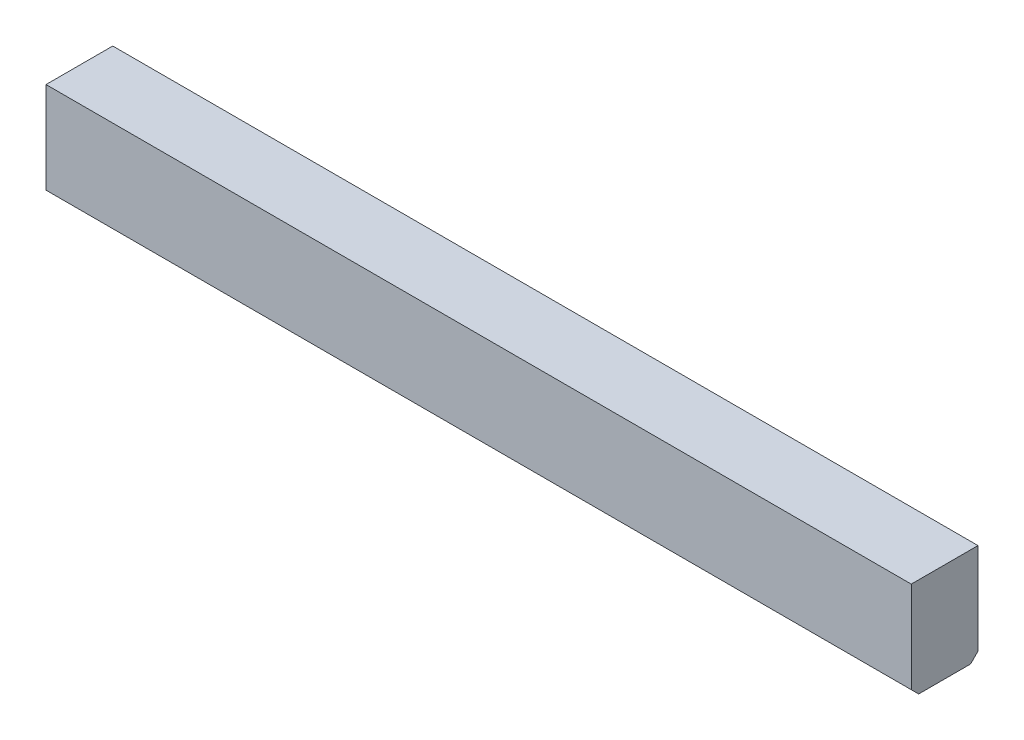
ISO-10303-21;
HEADER;
FILE_DESCRIPTION(('STEP AP214'),'2;1');
FILE_NAME('part.step','',(''),(''),'','','');
FILE_SCHEMA(('AUTOMOTIVE_DESIGN { 1 0 10303 214 1 1 1 1 }'));
ENDSEC;
DATA;
#1=APPLICATION_CONTEXT('core data for automotive mechanical design processes');
#2=APPLICATION_PROTOCOL_DEFINITION('international standard','automotive_design',2000,#1);
#3=PRODUCT_CONTEXT('',#1,'mechanical');
#4=PRODUCT('Part','Part','',(#3));
#5=PRODUCT_RELATED_PRODUCT_CATEGORY('part','',(#4));
#6=PRODUCT_DEFINITION_FORMATION('','',#4);
#7=PRODUCT_DEFINITION_CONTEXT('part definition',#1,'design');
#8=PRODUCT_DEFINITION('design','',#6,#7);
#9=PRODUCT_DEFINITION_SHAPE('','',#8);
#10=(LENGTH_UNIT() NAMED_UNIT(*) SI_UNIT(.MILLI.,.METRE.));
#11=(NAMED_UNIT(*) PLANE_ANGLE_UNIT() SI_UNIT($,.RADIAN.));
#12=(NAMED_UNIT(*) SI_UNIT($,.STERADIAN.) SOLID_ANGLE_UNIT());
#13=UNCERTAINTY_MEASURE_WITH_UNIT(LENGTH_MEASURE(1.E-05),#10,'distance_accuracy_value','');
#14=(GEOMETRIC_REPRESENTATION_CONTEXT(3) GLOBAL_UNCERTAINTY_ASSIGNED_CONTEXT((#13)) GLOBAL_UNIT_ASSIGNED_CONTEXT((#10,
#11,#12)) REPRESENTATION_CONTEXT('',''));
#15=CARTESIAN_POINT('',(0.,0.,0.));
#16=DIRECTION('',(0.,0.,1.));
#17=DIRECTION('',(1.,0.,0.));
#18=AXIS2_PLACEMENT_3D('',#15,#16,#17);
#19=CARTESIAN_POINT('',(0.,0.,27.));
#20=DIRECTION('',(1.,0.,0.));
#21=DIRECTION('',(0.,0.,-1.));
#22=AXIS2_PLACEMENT_3D('',#19,#20,#21);
#23=PLANE('',#22);
#24=DIRECTION('',(0.,-1.,0.));
#25=VECTOR('',#24,1.);
#26=CARTESIAN_POINT('',(0.,0.,0.));
#27=LINE('',#26,#25);
#28=CARTESIAN_POINT('',(0.,40.,0.));
#29=VERTEX_POINT('',#28);
#30=CARTESIAN_POINT('',(0.,2.99999999999998,0.));
#31=VERTEX_POINT('',#30);
#32=EDGE_CURVE('E122',#29,#31,#27,.T.);
#33=ORIENTED_EDGE('',*,*,#32,.T.);
#34=DIRECTION('',(0.,-0.707106781186551,0.707106781186544));
#35=VECTOR('',#34,1.);
#36=CARTESIAN_POINT('',(0.,0.,2.99999999999995));
#37=LINE('',#36,#35);
#38=CARTESIAN_POINT('',(0.,0.,2.99999999999995));
#39=VERTEX_POINT('',#38);
#40=EDGE_CURVE('E48',#31,#39,#37,.T.);
#41=ORIENTED_EDGE('',*,*,#40,.T.);
#42=DIRECTION('',(0.,0.,-1.));
#43=VECTOR('',#42,1.);
#44=CARTESIAN_POINT('',(0.,0.,27.));
#45=LINE('',#44,#43);
#46=CARTESIAN_POINT('',(0.,0.,24.));
#47=VERTEX_POINT('',#46);
#48=EDGE_CURVE('E128',#47,#39,#45,.T.);
#49=ORIENTED_EDGE('',*,*,#48,.F.);
#50=DIRECTION('',(0.,-0.707106781186544,-0.707106781186551));
#51=VECTOR('',#50,1.);
#52=CARTESIAN_POINT('',(0.,3.,27.));
#53=LINE('',#52,#51);
#54=CARTESIAN_POINT('',(0.,3.,27.));
#55=VERTEX_POINT('',#54);
#56=EDGE_CURVE('E55',#47,#55,#53,.F.);
#57=ORIENTED_EDGE('',*,*,#56,.T.);
#58=DIRECTION('',(0.,-1.,0.));
#59=VECTOR('',#58,1.);
#60=CARTESIAN_POINT('',(0.,0.,27.));
#61=LINE('',#60,#59);
#62=CARTESIAN_POINT('',(0.,40.,27.));
#63=VERTEX_POINT('',#62);
#64=EDGE_CURVE('E104',#63,#55,#61,.T.);
#65=ORIENTED_EDGE('',*,*,#64,.F.);
#66=DIRECTION('',(0.,0.,-1.));
#67=VECTOR('',#66,1.);
#68=CARTESIAN_POINT('',(0.,40.,27.));
#69=LINE('',#68,#67);
#70=EDGE_CURVE('E114',#63,#29,#69,.T.);
#71=ORIENTED_EDGE('',*,*,#70,.T.);
#72=EDGE_LOOP('',(#33,#41,#49,#57,#65,#71));
#73=FACE_BOUND('',#72,.T.);
#74=ADVANCED_FACE('F39',(#73),#23,.F.);
#75=CARTESIAN_POINT('',(0.,0.,27.));
#76=DIRECTION('',(0.,1.,0.));
#77=DIRECTION('',(0.,0.,1.));
#78=AXIS2_PLACEMENT_3D('',#75,#76,#77);
#79=PLANE('',#78);
#80=ORIENTED_EDGE('',*,*,#48,.T.);
#81=DIRECTION('',(1.,0.,0.));
#82=VECTOR('',#81,1.);
#83=CARTESIAN_POINT('',(350.,0.,2.99999999999995));
#84=LINE('',#83,#82);
#85=CARTESIAN_POINT('',(350.,0.,2.99999999999995));
#86=VERTEX_POINT('',#85);
#87=EDGE_CURVE('E133',#39,#86,#84,.T.);
#88=ORIENTED_EDGE('',*,*,#87,.T.);
#89=DIRECTION('',(0.,0.,-1.));
#90=VECTOR('',#89,1.);
#91=CARTESIAN_POINT('',(350.,0.,27.));
#92=LINE('',#91,#90);
#93=CARTESIAN_POINT('',(350.,0.,24.));
#94=VERTEX_POINT('',#93);
#95=EDGE_CURVE('E113',#94,#86,#92,.T.);
#96=ORIENTED_EDGE('',*,*,#95,.F.);
#97=DIRECTION('',(-1.,0.,0.));
#98=VECTOR('',#97,1.);
#99=CARTESIAN_POINT('',(0.,0.,24.));
#100=LINE('',#99,#98);
#101=EDGE_CURVE('E131',#94,#47,#100,.T.);
#102=ORIENTED_EDGE('',*,*,#101,.T.);
#103=EDGE_LOOP('',(#80,#88,#96,#102));
#104=FACE_BOUND('',#103,.T.);
#105=ADVANCED_FACE('F145',(#104),#79,.F.);
#106=CARTESIAN_POINT('',(350.,0.,27.));
#107=DIRECTION('',(-1.,0.,0.));
#108=DIRECTION('',(0.,0.,1.));
#109=AXIS2_PLACEMENT_3D('',#106,#107,#108);
#110=PLANE('',#109);
#111=ORIENTED_EDGE('',*,*,#95,.T.);
#112=DIRECTION('',(0.,0.707106781186551,-0.707106781186544));
#113=VECTOR('',#112,1.);
#114=CARTESIAN_POINT('',(350.,0.,2.99999999999995));
#115=LINE('',#114,#113);
#116=CARTESIAN_POINT('',(350.,2.99999999999998,0.));
#117=VERTEX_POINT('',#116);
#118=EDGE_CURVE('E138',#86,#117,#115,.T.);
#119=ORIENTED_EDGE('',*,*,#118,.T.);
#120=DIRECTION('',(0.,1.,0.));
#121=VECTOR('',#120,1.);
#122=CARTESIAN_POINT('',(350.,0.,0.));
#123=LINE('',#122,#121);
#124=CARTESIAN_POINT('',(350.,40.,0.));
#125=VERTEX_POINT('',#124);
#126=EDGE_CURVE('E110',#117,#125,#123,.T.);
#127=ORIENTED_EDGE('',*,*,#126,.T.);
#128=DIRECTION('',(0.,0.,-1.));
#129=VECTOR('',#128,1.);
#130=CARTESIAN_POINT('',(350.,40.,27.));
#131=LINE('',#130,#129);
#132=CARTESIAN_POINT('',(350.,40.,27.));
#133=VERTEX_POINT('',#132);
#134=EDGE_CURVE('E107',#133,#125,#131,.T.);
#135=ORIENTED_EDGE('',*,*,#134,.F.);
#136=DIRECTION('',(0.,1.,0.));
#137=VECTOR('',#136,1.);
#138=CARTESIAN_POINT('',(350.,0.,27.));
#139=LINE('',#138,#137);
#140=CARTESIAN_POINT('',(350.,3.,27.));
#141=VERTEX_POINT('',#140);
#142=EDGE_CURVE('E96',#141,#133,#139,.T.);
#143=ORIENTED_EDGE('',*,*,#142,.F.);
#144=DIRECTION('',(0.,0.707106781186544,0.707106781186551));
#145=VECTOR('',#144,1.);
#146=CARTESIAN_POINT('',(350.,3.,27.));
#147=LINE('',#146,#145);
#148=EDGE_CURVE('E136',#141,#94,#147,.F.);
#149=ORIENTED_EDGE('',*,*,#148,.T.);
#150=EDGE_LOOP('',(#111,#119,#127,#135,#143,#149));
#151=FACE_BOUND('',#150,.T.);
#152=ADVANCED_FACE('F109',(#151),#110,.F.);
#153=CARTESIAN_POINT('',(0.,40.,27.));
#154=DIRECTION('',(0.,-1.,0.));
#155=DIRECTION('',(0.,0.,-1.));
#156=AXIS2_PLACEMENT_3D('',#153,#154,#155);
#157=PLANE('',#156);
#158=DIRECTION('',(-1.,0.,0.));
#159=VECTOR('',#158,1.);
#160=CARTESIAN_POINT('',(0.,40.,0.));
#161=LINE('',#160,#159);
#162=EDGE_CURVE('E125',#125,#29,#161,.T.);
#163=ORIENTED_EDGE('',*,*,#162,.T.);
#164=ORIENTED_EDGE('',*,*,#70,.F.);
#165=DIRECTION('',(-1.,0.,0.));
#166=VECTOR('',#165,1.);
#167=CARTESIAN_POINT('',(0.,40.,27.));
#168=LINE('',#167,#166);
#169=EDGE_CURVE('E100',#133,#63,#168,.T.);
#170=ORIENTED_EDGE('',*,*,#169,.F.);
#171=ORIENTED_EDGE('',*,*,#134,.T.);
#172=EDGE_LOOP('',(#163,#164,#170,#171));
#173=FACE_BOUND('',#172,.T.);
#174=ADVANCED_FACE('F116',(#173),#157,.F.);
#175=CARTESIAN_POINT('',(0.,0.,27.));
#176=DIRECTION('',(0.,0.,-1.));
#177=DIRECTION('',(-1.,0.,0.));
#178=AXIS2_PLACEMENT_3D('',#175,#176,#177);
#179=PLANE('',#178);
#180=ORIENTED_EDGE('',*,*,#64,.T.);
#181=DIRECTION('',(1.,0.,0.));
#182=VECTOR('',#181,1.);
#183=CARTESIAN_POINT('',(0.,3.,27.));
#184=LINE('',#183,#182);
#185=EDGE_CURVE('E11',#55,#141,#184,.T.);
#186=ORIENTED_EDGE('',*,*,#185,.T.);
#187=ORIENTED_EDGE('',*,*,#142,.T.);
#188=ORIENTED_EDGE('',*,*,#169,.T.);
#189=EDGE_LOOP('',(#180,#186,#187,#188));
#190=FACE_BOUND('',#189,.T.);
#191=ADVANCED_FACE('F98',(#190),#179,.F.);
#192=CARTESIAN_POINT('',(0.,0.,0.));
#193=DIRECTION('',(0.,0.,-1.));
#194=DIRECTION('',(-1.,0.,0.));
#195=AXIS2_PLACEMENT_3D('',#192,#193,#194);
#196=PLANE('',#195);
#197=ORIENTED_EDGE('',*,*,#126,.F.);
#198=DIRECTION('',(-1.,0.,0.));
#199=VECTOR('',#198,1.);
#200=CARTESIAN_POINT('',(0.,2.99999999999998,0.));
#201=LINE('',#200,#199);
#202=EDGE_CURVE('E63',#117,#31,#201,.T.);
#203=ORIENTED_EDGE('',*,*,#202,.T.);
#204=ORIENTED_EDGE('',*,*,#32,.F.);
#205=ORIENTED_EDGE('',*,*,#162,.F.);
#206=EDGE_LOOP('',(#197,#203,#204,#205));
#207=FACE_BOUND('',#206,.T.);
#208=ADVANCED_FACE('F149',(#207),#196,.T.);
#209=CARTESIAN_POINT('',(0.,0.,2.99999999999995));
#210=DIRECTION('',(0.,-0.707106781186544,-0.707106781186551));
#211=DIRECTION('',(-1.,0.,0.));
#212=AXIS2_PLACEMENT_3D('',#209,#210,#211);
#213=PLANE('',#212);
#214=ORIENTED_EDGE('',*,*,#40,.F.);
#215=ORIENTED_EDGE('',*,*,#202,.F.);
#216=ORIENTED_EDGE('',*,*,#118,.F.);
#217=ORIENTED_EDGE('',*,*,#87,.F.);
#218=EDGE_LOOP('',(#214,#215,#216,#217));
#219=FACE_BOUND('',#218,.T.);
#220=ADVANCED_FACE('F148',(#219),#213,.T.);
#221=CARTESIAN_POINT('',(0.,3.,27.));
#222=DIRECTION('',(0.,0.707106781186551,-0.707106781186544));
#223=DIRECTION('',(1.,0.,0.));
#224=AXIS2_PLACEMENT_3D('',#221,#222,#223);
#225=PLANE('',#224);
#226=ORIENTED_EDGE('',*,*,#56,.F.);
#227=ORIENTED_EDGE('',*,*,#101,.F.);
#228=ORIENTED_EDGE('',*,*,#148,.F.);
#229=ORIENTED_EDGE('',*,*,#185,.F.);
#230=EDGE_LOOP('',(#226,#227,#228,#229));
#231=FACE_BOUND('',#230,.T.);
#232=ADVANCED_FACE('F42',(#231),#225,.F.);
#233=CLOSED_SHELL('',(#74,#105,#152,#174,#191,#208,#220,#232));
#234=MANIFOLD_SOLID_BREP('B2',#233);
#235=ADVANCED_BREP_SHAPE_REPRESENTATION('',(#18,#234),#14);
#236=SHAPE_DEFINITION_REPRESENTATION(#9,#235);
ENDSEC;
END-ISO-10303-21;
